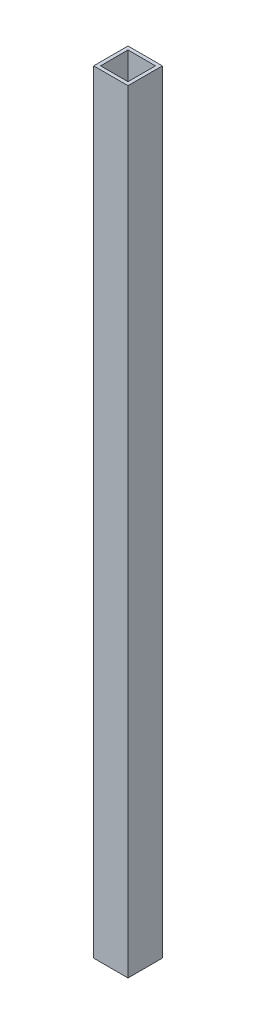
ISO-10303-21;
HEADER;
FILE_DESCRIPTION(('STEP AP214'),'2;1');
FILE_NAME('part.step','',(''),(''),'','','');
FILE_SCHEMA(('AUTOMOTIVE_DESIGN { 1 0 10303 214 1 1 1 1 }'));
ENDSEC;
DATA;
#1=APPLICATION_CONTEXT('core data for automotive mechanical design processes');
#2=APPLICATION_PROTOCOL_DEFINITION('international standard','automotive_design',2000,#1);
#3=PRODUCT_CONTEXT('',#1,'mechanical');
#4=PRODUCT('Part','Part','',(#3));
#5=PRODUCT_RELATED_PRODUCT_CATEGORY('part','',(#4));
#6=PRODUCT_DEFINITION_FORMATION('','',#4);
#7=PRODUCT_DEFINITION_CONTEXT('part definition',#1,'design');
#8=PRODUCT_DEFINITION('design','',#6,#7);
#9=PRODUCT_DEFINITION_SHAPE('','',#8);
#10=(LENGTH_UNIT() NAMED_UNIT(*) SI_UNIT(.MILLI.,.METRE.));
#11=(NAMED_UNIT(*) PLANE_ANGLE_UNIT() SI_UNIT($,.RADIAN.));
#12=(NAMED_UNIT(*) SI_UNIT($,.STERADIAN.) SOLID_ANGLE_UNIT());
#13=UNCERTAINTY_MEASURE_WITH_UNIT(LENGTH_MEASURE(1.E-05),#10,'distance_accuracy_value','');
#14=(GEOMETRIC_REPRESENTATION_CONTEXT(3) GLOBAL_UNCERTAINTY_ASSIGNED_CONTEXT((#13)) GLOBAL_UNIT_ASSIGNED_CONTEXT((#10,
#11,#12)) REPRESENTATION_CONTEXT('',''));
#15=CARTESIAN_POINT('',(0.,0.,0.));
#16=DIRECTION('',(0.,0.,1.));
#17=DIRECTION('',(1.,0.,0.));
#18=AXIS2_PLACEMENT_3D('',#15,#16,#17);
#19=CARTESIAN_POINT('',(0.,225.,0.));
#20=DIRECTION('',(0.,-1.,0.));
#21=DIRECTION('',(0.,0.,-1.));
#22=AXIS2_PLACEMENT_3D('',#19,#20,#21);
#23=PLANE('',#22);
#24=DIRECTION('',(0.,0.,-1.));
#25=VECTOR('',#24,1.);
#26=CARTESIAN_POINT('',(10.,225.,10.));
#27=LINE('',#26,#25);
#28=CARTESIAN_POINT('',(10.,225.,10.));
#29=VERTEX_POINT('',#28);
#30=CARTESIAN_POINT('',(10.,225.,-10.));
#31=VERTEX_POINT('',#30);
#32=EDGE_CURVE('E159',#29,#31,#27,.T.);
#33=ORIENTED_EDGE('',*,*,#32,.T.);
#34=DIRECTION('',(-1.,0.,0.));
#35=VECTOR('',#34,1.);
#36=CARTESIAN_POINT('',(-10.,225.,-10.));
#37=LINE('',#36,#35);
#38=CARTESIAN_POINT('',(-10.,225.,-10.));
#39=VERTEX_POINT('',#38);
#40=EDGE_CURVE('E163',#31,#39,#37,.T.);
#41=ORIENTED_EDGE('',*,*,#40,.T.);
#42=DIRECTION('',(0.,0.,1.));
#43=VECTOR('',#42,1.);
#44=CARTESIAN_POINT('',(-10.,225.,10.));
#45=LINE('',#44,#43);
#46=CARTESIAN_POINT('',(-10.,225.,10.));
#47=VERTEX_POINT('',#46);
#48=EDGE_CURVE('E167',#39,#47,#45,.T.);
#49=ORIENTED_EDGE('',*,*,#48,.T.);
#50=DIRECTION('',(1.,0.,0.));
#51=VECTOR('',#50,1.);
#52=CARTESIAN_POINT('',(-10.,225.,10.));
#53=LINE('',#52,#51);
#54=EDGE_CURVE('E170',#47,#29,#53,.T.);
#55=ORIENTED_EDGE('',*,*,#54,.T.);
#56=EDGE_LOOP('',(#33,#41,#49,#55));
#57=FACE_BOUND('',#56,.T.);
#58=DIRECTION('',(1.,0.,0.));
#59=VECTOR('',#58,1.);
#60=CARTESIAN_POINT('',(-8.,225.,8.));
#61=LINE('',#60,#59);
#62=CARTESIAN_POINT('',(-8.,225.,8.));
#63=VERTEX_POINT('',#62);
#64=CARTESIAN_POINT('',(8.,225.,8.));
#65=VERTEX_POINT('',#64);
#66=EDGE_CURVE('E111',#63,#65,#61,.T.);
#67=ORIENTED_EDGE('',*,*,#66,.F.);
#68=DIRECTION('',(0.,0.,1.));
#69=VECTOR('',#68,1.);
#70=CARTESIAN_POINT('',(-8.,225.,8.));
#71=LINE('',#70,#69);
#72=CARTESIAN_POINT('',(-8.,225.,-8.));
#73=VERTEX_POINT('',#72);
#74=EDGE_CURVE('E137',#73,#63,#71,.T.);
#75=ORIENTED_EDGE('',*,*,#74,.F.);
#76=DIRECTION('',(-1.,0.,0.));
#77=VECTOR('',#76,1.);
#78=CARTESIAN_POINT('',(-8.,225.,-8.));
#79=LINE('',#78,#77);
#80=CARTESIAN_POINT('',(8.,225.,-8.));
#81=VERTEX_POINT('',#80);
#82=EDGE_CURVE('E133',#81,#73,#79,.T.);
#83=ORIENTED_EDGE('',*,*,#82,.F.);
#84=DIRECTION('',(0.,0.,-1.));
#85=VECTOR('',#84,1.);
#86=CARTESIAN_POINT('',(8.,225.,8.));
#87=LINE('',#86,#85);
#88=EDGE_CURVE('E120',#65,#81,#87,.T.);
#89=ORIENTED_EDGE('',*,*,#88,.F.);
#90=EDGE_LOOP('',(#67,#75,#83,#89));
#91=FACE_BOUND('',#90,.T.);
#92=ADVANCED_FACE('F45',(#57,#91),#23,.F.);
#93=CARTESIAN_POINT('',(0.,-225.,0.));
#94=DIRECTION('',(0.,-1.,0.));
#95=DIRECTION('',(0.,0.,-1.));
#96=AXIS2_PLACEMENT_3D('',#93,#94,#95);
#97=PLANE('',#96);
#98=DIRECTION('',(0.,0.,-1.));
#99=VECTOR('',#98,1.);
#100=CARTESIAN_POINT('',(10.,-225.,10.));
#101=LINE('',#100,#99);
#102=CARTESIAN_POINT('',(10.,-225.,10.));
#103=VERTEX_POINT('',#102);
#104=CARTESIAN_POINT('',(10.,-225.,-10.));
#105=VERTEX_POINT('',#104);
#106=EDGE_CURVE('E129',#103,#105,#101,.T.);
#107=ORIENTED_EDGE('',*,*,#106,.F.);
#108=DIRECTION('',(1.,0.,0.));
#109=VECTOR('',#108,1.);
#110=CARTESIAN_POINT('',(-10.,-225.,10.));
#111=LINE('',#110,#109);
#112=CARTESIAN_POINT('',(-10.,-225.,10.));
#113=VERTEX_POINT('',#112);
#114=EDGE_CURVE('E164',#113,#103,#111,.T.);
#115=ORIENTED_EDGE('',*,*,#114,.F.);
#116=DIRECTION('',(0.,0.,1.));
#117=VECTOR('',#116,1.);
#118=CARTESIAN_POINT('',(-10.,-225.,10.));
#119=LINE('',#118,#117);
#120=CARTESIAN_POINT('',(-10.,-225.,-10.));
#121=VERTEX_POINT('',#120);
#122=EDGE_CURVE('E180',#121,#113,#119,.T.);
#123=ORIENTED_EDGE('',*,*,#122,.F.);
#124=DIRECTION('',(-1.,0.,0.));
#125=VECTOR('',#124,1.);
#126=CARTESIAN_POINT('',(-10.,-225.,-10.));
#127=LINE('',#126,#125);
#128=EDGE_CURVE('E177',#105,#121,#127,.T.);
#129=ORIENTED_EDGE('',*,*,#128,.F.);
#130=EDGE_LOOP('',(#107,#115,#123,#129));
#131=FACE_BOUND('',#130,.T.);
#132=DIRECTION('',(0.,0.,1.));
#133=VECTOR('',#132,1.);
#134=CARTESIAN_POINT('',(-8.,-225.,8.));
#135=LINE('',#134,#133);
#136=CARTESIAN_POINT('',(-8.,-225.,-8.));
#137=VERTEX_POINT('',#136);
#138=CARTESIAN_POINT('',(-8.,-225.,8.));
#139=VERTEX_POINT('',#138);
#140=EDGE_CURVE('E121',#137,#139,#135,.T.);
#141=ORIENTED_EDGE('',*,*,#140,.T.);
#142=DIRECTION('',(1.,0.,0.));
#143=VECTOR('',#142,1.);
#144=CARTESIAN_POINT('',(-8.,-225.,8.));
#145=LINE('',#144,#143);
#146=CARTESIAN_POINT('',(8.,-225.,8.));
#147=VERTEX_POINT('',#146);
#148=EDGE_CURVE('E69',#139,#147,#145,.T.);
#149=ORIENTED_EDGE('',*,*,#148,.T.);
#150=DIRECTION('',(0.,0.,-1.));
#151=VECTOR('',#150,1.);
#152=CARTESIAN_POINT('',(8.,-225.,8.));
#153=LINE('',#152,#151);
#154=CARTESIAN_POINT('',(8.,-225.,-8.));
#155=VERTEX_POINT('',#154);
#156=EDGE_CURVE('E127',#147,#155,#153,.T.);
#157=ORIENTED_EDGE('',*,*,#156,.T.);
#158=DIRECTION('',(-1.,0.,0.));
#159=VECTOR('',#158,1.);
#160=CARTESIAN_POINT('',(-8.,-225.,-8.));
#161=LINE('',#160,#159);
#162=EDGE_CURVE('E146',#155,#137,#161,.T.);
#163=ORIENTED_EDGE('',*,*,#162,.T.);
#164=EDGE_LOOP('',(#141,#149,#157,#163));
#165=FACE_BOUND('',#164,.T.);
#166=ADVANCED_FACE('F203',(#131,#165),#97,.T.);
#167=CARTESIAN_POINT('',(10.,225.,10.));
#168=DIRECTION('',(-1.,0.,0.));
#169=DIRECTION('',(0.,0.,1.));
#170=AXIS2_PLACEMENT_3D('',#167,#168,#169);
#171=PLANE('',#170);
#172=ORIENTED_EDGE('',*,*,#106,.T.);
#173=DIRECTION('',(0.,-1.,0.));
#174=VECTOR('',#173,1.);
#175=CARTESIAN_POINT('',(10.,225.,-10.));
#176=LINE('',#175,#174);
#177=EDGE_CURVE('E11',#31,#105,#176,.T.);
#178=ORIENTED_EDGE('',*,*,#177,.F.);
#179=ORIENTED_EDGE('',*,*,#32,.F.);
#180=DIRECTION('',(0.,-1.,0.));
#181=VECTOR('',#180,1.);
#182=CARTESIAN_POINT('',(10.,225.,10.));
#183=LINE('',#182,#181);
#184=EDGE_CURVE('E173',#29,#103,#183,.T.);
#185=ORIENTED_EDGE('',*,*,#184,.T.);
#186=EDGE_LOOP('',(#172,#178,#179,#185));
#187=FACE_BOUND('',#186,.T.);
#188=ADVANCED_FACE('F47',(#187),#171,.F.);
#189=CARTESIAN_POINT('',(-10.,225.,-10.));
#190=DIRECTION('',(0.,0.,1.));
#191=DIRECTION('',(1.,0.,0.));
#192=AXIS2_PLACEMENT_3D('',#189,#190,#191);
#193=PLANE('',#192);
#194=ORIENTED_EDGE('',*,*,#128,.T.);
#195=DIRECTION('',(0.,-1.,0.));
#196=VECTOR('',#195,1.);
#197=CARTESIAN_POINT('',(-10.,225.,-10.));
#198=LINE('',#197,#196);
#199=EDGE_CURVE('E54',#39,#121,#198,.T.);
#200=ORIENTED_EDGE('',*,*,#199,.F.);
#201=ORIENTED_EDGE('',*,*,#40,.F.);
#202=ORIENTED_EDGE('',*,*,#177,.T.);
#203=EDGE_LOOP('',(#194,#200,#201,#202));
#204=FACE_BOUND('',#203,.T.);
#205=ADVANCED_FACE('F213',(#204),#193,.F.);
#206=CARTESIAN_POINT('',(-10.,225.,10.));
#207=DIRECTION('',(1.,0.,0.));
#208=DIRECTION('',(0.,0.,-1.));
#209=AXIS2_PLACEMENT_3D('',#206,#207,#208);
#210=PLANE('',#209);
#211=ORIENTED_EDGE('',*,*,#122,.T.);
#212=DIRECTION('',(0.,-1.,0.));
#213=VECTOR('',#212,1.);
#214=CARTESIAN_POINT('',(-10.,225.,10.));
#215=LINE('',#214,#213);
#216=EDGE_CURVE('E188',#47,#113,#215,.T.);
#217=ORIENTED_EDGE('',*,*,#216,.F.);
#218=ORIENTED_EDGE('',*,*,#48,.F.);
#219=ORIENTED_EDGE('',*,*,#199,.T.);
#220=EDGE_LOOP('',(#211,#217,#218,#219));
#221=FACE_BOUND('',#220,.T.);
#222=ADVANCED_FACE('F197',(#221),#210,.F.);
#223=CARTESIAN_POINT('',(-10.,225.,10.));
#224=DIRECTION('',(0.,0.,-1.));
#225=DIRECTION('',(-1.,0.,0.));
#226=AXIS2_PLACEMENT_3D('',#223,#224,#225);
#227=PLANE('',#226);
#228=ORIENTED_EDGE('',*,*,#114,.T.);
#229=ORIENTED_EDGE('',*,*,#184,.F.);
#230=ORIENTED_EDGE('',*,*,#54,.F.);
#231=ORIENTED_EDGE('',*,*,#216,.T.);
#232=EDGE_LOOP('',(#228,#229,#230,#231));
#233=FACE_BOUND('',#232,.T.);
#234=ADVANCED_FACE('F207',(#233),#227,.F.);
#235=CARTESIAN_POINT('',(-8.,225.,8.));
#236=DIRECTION('',(0.,0.,-1.));
#237=DIRECTION('',(-1.,0.,0.));
#238=AXIS2_PLACEMENT_3D('',#235,#236,#237);
#239=PLANE('',#238);
#240=ORIENTED_EDGE('',*,*,#148,.F.);
#241=DIRECTION('',(0.,-1.,0.));
#242=VECTOR('',#241,1.);
#243=CARTESIAN_POINT('',(-8.,225.,8.));
#244=LINE('',#243,#242);
#245=EDGE_CURVE('E115',#63,#139,#244,.T.);
#246=ORIENTED_EDGE('',*,*,#245,.F.);
#247=ORIENTED_EDGE('',*,*,#66,.T.);
#248=DIRECTION('',(0.,-1.,0.));
#249=VECTOR('',#248,1.);
#250=CARTESIAN_POINT('',(8.,225.,8.));
#251=LINE('',#250,#249);
#252=EDGE_CURVE('E114',#65,#147,#251,.T.);
#253=ORIENTED_EDGE('',*,*,#252,.T.);
#254=EDGE_LOOP('',(#240,#246,#247,#253));
#255=FACE_BOUND('',#254,.T.);
#256=ADVANCED_FACE('F113',(#255),#239,.T.);
#257=CARTESIAN_POINT('',(8.,225.,8.));
#258=DIRECTION('',(-1.,0.,0.));
#259=DIRECTION('',(0.,0.,1.));
#260=AXIS2_PLACEMENT_3D('',#257,#258,#259);
#261=PLANE('',#260);
#262=ORIENTED_EDGE('',*,*,#156,.F.);
#263=ORIENTED_EDGE('',*,*,#252,.F.);
#264=ORIENTED_EDGE('',*,*,#88,.T.);
#265=DIRECTION('',(0.,-1.,0.));
#266=VECTOR('',#265,1.);
#267=CARTESIAN_POINT('',(8.,225.,-8.));
#268=LINE('',#267,#266);
#269=EDGE_CURVE('E130',#81,#155,#268,.T.);
#270=ORIENTED_EDGE('',*,*,#269,.T.);
#271=EDGE_LOOP('',(#262,#263,#264,#270));
#272=FACE_BOUND('',#271,.T.);
#273=ADVANCED_FACE('F124',(#272),#261,.T.);
#274=CARTESIAN_POINT('',(-8.,225.,-8.));
#275=DIRECTION('',(0.,0.,1.));
#276=DIRECTION('',(1.,0.,0.));
#277=AXIS2_PLACEMENT_3D('',#274,#275,#276);
#278=PLANE('',#277);
#279=ORIENTED_EDGE('',*,*,#162,.F.);
#280=ORIENTED_EDGE('',*,*,#269,.F.);
#281=ORIENTED_EDGE('',*,*,#82,.T.);
#282=DIRECTION('',(0.,-1.,0.));
#283=VECTOR('',#282,1.);
#284=CARTESIAN_POINT('',(-8.,225.,-8.));
#285=LINE('',#284,#283);
#286=EDGE_CURVE('E61',#73,#137,#285,.T.);
#287=ORIENTED_EDGE('',*,*,#286,.T.);
#288=EDGE_LOOP('',(#279,#280,#281,#287));
#289=FACE_BOUND('',#288,.T.);
#290=ADVANCED_FACE('F236',(#289),#278,.T.);
#291=CARTESIAN_POINT('',(-8.,225.,8.));
#292=DIRECTION('',(1.,0.,0.));
#293=DIRECTION('',(0.,0.,-1.));
#294=AXIS2_PLACEMENT_3D('',#291,#292,#293);
#295=PLANE('',#294);
#296=ORIENTED_EDGE('',*,*,#140,.F.);
#297=ORIENTED_EDGE('',*,*,#286,.F.);
#298=ORIENTED_EDGE('',*,*,#74,.T.);
#299=ORIENTED_EDGE('',*,*,#245,.T.);
#300=EDGE_LOOP('',(#296,#297,#298,#299));
#301=FACE_BOUND('',#300,.T.);
#302=ADVANCED_FACE('F240',(#301),#295,.T.);
#303=CLOSED_SHELL('',(#92,#166,#188,#205,#222,#234,#256,#273,#290,#302));
#304=MANIFOLD_SOLID_BREP('B2',#303);
#305=ADVANCED_BREP_SHAPE_REPRESENTATION('',(#18,#304),#14);
#306=SHAPE_DEFINITION_REPRESENTATION(#9,#305);
ENDSEC;
END-ISO-10303-21;
